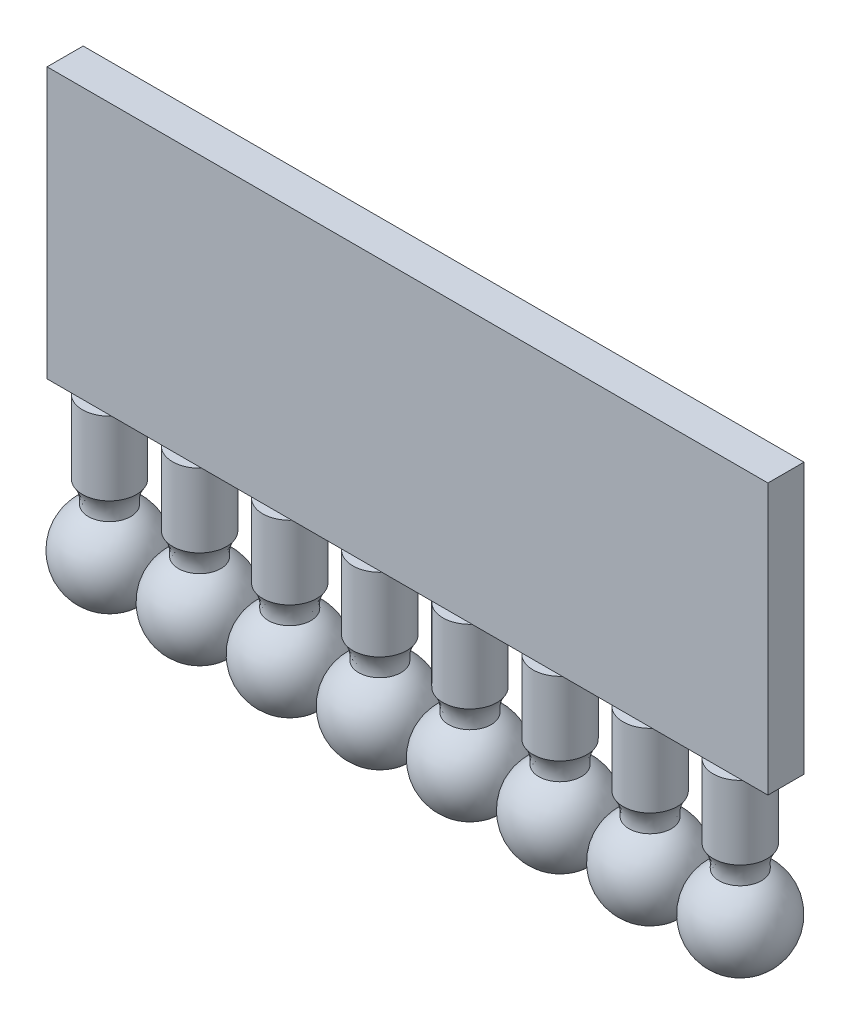
ISO-10303-21;
HEADER;
FILE_DESCRIPTION(('STEP AP214'),'2;1');
FILE_NAME('part.step','',(''),(''),'','','');
FILE_SCHEMA(('AUTOMOTIVE_DESIGN { 1 0 10303 214 1 1 1 1 }'));
ENDSEC;
DATA;
#1=APPLICATION_CONTEXT('core data for automotive mechanical design processes');
#2=APPLICATION_PROTOCOL_DEFINITION('international standard','automotive_design',2000,#1);
#3=PRODUCT_CONTEXT('',#1,'mechanical');
#4=PRODUCT('Part','Part','',(#3));
#5=PRODUCT_RELATED_PRODUCT_CATEGORY('part','',(#4));
#6=PRODUCT_DEFINITION_FORMATION('','',#4);
#7=PRODUCT_DEFINITION_CONTEXT('part definition',#1,'design');
#8=PRODUCT_DEFINITION('design','',#6,#7);
#9=PRODUCT_DEFINITION_SHAPE('','',#8);
#10=(LENGTH_UNIT() NAMED_UNIT(*) SI_UNIT(.MILLI.,.METRE.));
#11=(NAMED_UNIT(*) PLANE_ANGLE_UNIT() SI_UNIT($,.RADIAN.));
#12=(NAMED_UNIT(*) SI_UNIT($,.STERADIAN.) SOLID_ANGLE_UNIT());
#13=UNCERTAINTY_MEASURE_WITH_UNIT(LENGTH_MEASURE(1.E-05),#10,'distance_accuracy_value','');
#14=(GEOMETRIC_REPRESENTATION_CONTEXT(3) GLOBAL_UNCERTAINTY_ASSIGNED_CONTEXT((#13)) GLOBAL_UNIT_ASSIGNED_CONTEXT((#10,
#11,#12)) REPRESENTATION_CONTEXT('',''));
#15=CARTESIAN_POINT('',(0.,0.,0.));
#16=DIRECTION('',(0.,0.,1.));
#17=DIRECTION('',(1.,0.,0.));
#18=AXIS2_PLACEMENT_3D('',#15,#16,#17);
#19=CARTESIAN_POINT('',(37.4635416345214,0.,1.));
#20=DIRECTION('',(0.,-1.,0.));
#21=DIRECTION('',(1.,0.,0.));
#22=AXIS2_PLACEMENT_3D('',#19,#20,#21);
#23=PLANE('',#22);
#24=CARTESIAN_POINT('',(37.4635416345214,0.,1.));
#25=DIRECTION('',(0.,1.,0.));
#26=DIRECTION('',(-1.,0.,0.));
#27=AXIS2_PLACEMENT_3D('',#24,#25,#26);
#28=CIRCLE('',#27,1.5);
#29=CARTESIAN_POINT('',(35.9635416345214,0.,1.));
#30=VERTEX_POINT('',#29);
#31=EDGE_CURVE('E11',#30,#30,#28,.T.);
#32=ORIENTED_EDGE('',*,*,#31,.T.);
#33=EDGE_LOOP('',(#32));
#34=FACE_BOUND('',#33,.T.);
#35=ADVANCED_FACE('F45',(#34),#23,.F.);
#36=CARTESIAN_POINT('',(37.4635416345214,0.,1.));
#37=DIRECTION('',(0.,1.,0.));
#38=DIRECTION('',(-1.,0.,0.));
#39=AXIS2_PLACEMENT_3D('',#36,#37,#38);
#40=CYLINDRICAL_SURFACE('',#39,1.5);
#41=ORIENTED_EDGE('',*,*,#31,.F.);
#42=EDGE_LOOP('',(#41));
#43=FACE_BOUND('',#42,.T.);
#44=CARTESIAN_POINT('',(37.4635416345214,-4.07089085936718,1.));
#45=DIRECTION('',(0.,1.,0.));
#46=DIRECTION('',(-1.,0.,0.));
#47=AXIS2_PLACEMENT_3D('',#44,#45,#46);
#48=CIRCLE('',#47,1.5);
#49=CARTESIAN_POINT('',(35.9635416345214,-4.07089085936718,1.));
#50=VERTEX_POINT('',#49);
#51=EDGE_CURVE('E51',#50,#50,#48,.T.);
#52=ORIENTED_EDGE('',*,*,#51,.T.);
#53=EDGE_LOOP('',(#52));
#54=FACE_BOUND('',#53,.T.);
#55=ADVANCED_FACE('F72',(#43,#54),#40,.T.);
#56=CARTESIAN_POINT('',(38.6419699314246,-5.29516287470982,1.));
#57=CARTESIAN_POINT('',(38.571125169039,-4.639795433656,1.));
#58=CARTESIAN_POINT('',(38.9635416345214,-4.07089085936718,1.));
#59=B_SPLINE_CURVE_WITH_KNOTS('',2,(#56,#57,#58),.UNSPECIFIED.,.F.,.F.,(3,3),(0.,1.),.UNSPECIFIED.);
#60=CARTESIAN_POINT('',(37.4635416345214,0.,1.));
#61=DIRECTION('',(0.,1.,0.));
#62=AXIS1_PLACEMENT('',#60,#61);
#63=SURFACE_OF_REVOLUTION('',#59,#62);
#64=ORIENTED_EDGE('',*,*,#51,.F.);
#65=EDGE_LOOP('',(#64));
#66=FACE_BOUND('',#65,.T.);
#67=CARTESIAN_POINT('',(37.4635416345214,-5.29516287470982,1.));
#68=DIRECTION('',(0.,1.,0.));
#69=DIRECTION('',(-1.,0.,0.));
#70=AXIS2_PLACEMENT_3D('',#67,#68,#69);
#71=CIRCLE('',#70,1.17842829690319);
#72=CARTESIAN_POINT('',(36.2851133376182,-5.29516287470982,1.));
#73=VERTEX_POINT('',#72);
#74=EDGE_CURVE('E55',#73,#73,#71,.T.);
#75=ORIENTED_EDGE('',*,*,#74,.T.);
#76=EDGE_LOOP('',(#75));
#77=FACE_BOUND('',#76,.T.);
#78=ADVANCED_FACE('F68',(#66,#77),#63,.T.);
#79=CARTESIAN_POINT('',(37.4635416345214,-7.5,1.));
#80=DIRECTION('',(0.,1.,0.));
#81=DIRECTION('',(-1.,0.,0.));
#82=AXIS2_PLACEMENT_3D('',#79,#80,#81);
#83=SPHERICAL_SURFACE('',#82,2.5);
#84=ORIENTED_EDGE('',*,*,#74,.F.);
#85=EDGE_LOOP('',(#84));
#86=FACE_BOUND('',#85,.T.);
#87=ADVANCED_FACE('F71',(#86),#83,.T.);
#88=CLOSED_SHELL('',(#35,#55,#78,#87));
#89=MANIFOLD_SOLID_BREP('B2',#88);
#90=CARTESIAN_POINT('',(32.4635416345214,0.,1.));
#91=DIRECTION('',(0.,-1.,0.));
#92=DIRECTION('',(1.,0.,0.));
#93=AXIS2_PLACEMENT_3D('',#90,#91,#92);
#94=PLANE('',#93);
#95=CARTESIAN_POINT('',(32.4635416345214,0.,1.));
#96=DIRECTION('',(0.,1.,0.));
#97=DIRECTION('',(-1.,0.,0.));
#98=AXIS2_PLACEMENT_3D('',#95,#96,#97);
#99=CIRCLE('',#98,1.5);
#100=CARTESIAN_POINT('',(30.9635416345214,0.,1.));
#101=VERTEX_POINT('',#100);
#102=EDGE_CURVE('E44',#101,#101,#99,.T.);
#103=ORIENTED_EDGE('',*,*,#102,.T.);
#104=EDGE_LOOP('',(#103));
#105=FACE_BOUND('',#104,.T.);
#106=ADVANCED_FACE('F121',(#105),#94,.F.);
#107=CARTESIAN_POINT('',(32.4635416345214,0.,1.));
#108=DIRECTION('',(0.,1.,0.));
#109=DIRECTION('',(-1.,0.,0.));
#110=AXIS2_PLACEMENT_3D('',#107,#108,#109);
#111=CYLINDRICAL_SURFACE('',#110,1.5);
#112=ORIENTED_EDGE('',*,*,#102,.F.);
#113=EDGE_LOOP('',(#112));
#114=FACE_BOUND('',#113,.T.);
#115=CARTESIAN_POINT('',(32.4635416345214,-4.07089085936718,1.));
#116=DIRECTION('',(0.,1.,0.));
#117=DIRECTION('',(-1.,0.,0.));
#118=AXIS2_PLACEMENT_3D('',#115,#116,#117);
#119=CIRCLE('',#118,1.5);
#120=CARTESIAN_POINT('',(30.9635416345214,-4.07089085936718,1.));
#121=VERTEX_POINT('',#120);
#122=EDGE_CURVE('E127',#121,#121,#119,.T.);
#123=ORIENTED_EDGE('',*,*,#122,.T.);
#124=EDGE_LOOP('',(#123));
#125=FACE_BOUND('',#124,.T.);
#126=ADVANCED_FACE('F148',(#114,#125),#111,.T.);
#127=CARTESIAN_POINT('',(33.6419699314246,-5.29516287470982,1.));
#128=CARTESIAN_POINT('',(33.571125169039,-4.639795433656,1.));
#129=CARTESIAN_POINT('',(33.9635416345214,-4.07089085936718,1.));
#130=B_SPLINE_CURVE_WITH_KNOTS('',2,(#127,#128,#129),.UNSPECIFIED.,.F.,.F.,(3,3),(0.,1.),.UNSPECIFIED.);
#131=CARTESIAN_POINT('',(32.4635416345214,0.,1.));
#132=DIRECTION('',(0.,1.,0.));
#133=AXIS1_PLACEMENT('',#131,#132);
#134=SURFACE_OF_REVOLUTION('',#130,#133);
#135=ORIENTED_EDGE('',*,*,#122,.F.);
#136=EDGE_LOOP('',(#135));
#137=FACE_BOUND('',#136,.T.);
#138=CARTESIAN_POINT('',(32.4635416345214,-5.29516287470982,1.));
#139=DIRECTION('',(0.,1.,0.));
#140=DIRECTION('',(-1.,0.,0.));
#141=AXIS2_PLACEMENT_3D('',#138,#139,#140);
#142=CIRCLE('',#141,1.17842829690319);
#143=CARTESIAN_POINT('',(31.2851133376182,-5.29516287470982,1.));
#144=VERTEX_POINT('',#143);
#145=EDGE_CURVE('E131',#144,#144,#142,.T.);
#146=ORIENTED_EDGE('',*,*,#145,.T.);
#147=EDGE_LOOP('',(#146));
#148=FACE_BOUND('',#147,.T.);
#149=ADVANCED_FACE('F144',(#137,#148),#134,.T.);
#150=CARTESIAN_POINT('',(32.4635416345214,-7.5,1.));
#151=DIRECTION('',(0.,1.,0.));
#152=DIRECTION('',(-1.,0.,0.));
#153=AXIS2_PLACEMENT_3D('',#150,#151,#152);
#154=SPHERICAL_SURFACE('',#153,2.5);
#155=ORIENTED_EDGE('',*,*,#145,.F.);
#156=EDGE_LOOP('',(#155));
#157=FACE_BOUND('',#156,.T.);
#158=ADVANCED_FACE('F147',(#157),#154,.T.);
#159=CLOSED_SHELL('',(#106,#126,#149,#158));
#160=MANIFOLD_SOLID_BREP('B6',#159);
#161=CARTESIAN_POINT('',(27.4635416345214,0.,1.));
#162=DIRECTION('',(0.,-1.,0.));
#163=DIRECTION('',(1.,0.,0.));
#164=AXIS2_PLACEMENT_3D('',#161,#162,#163);
#165=PLANE('',#164);
#166=CARTESIAN_POINT('',(27.4635416345214,0.,1.));
#167=DIRECTION('',(0.,1.,0.));
#168=DIRECTION('',(-1.,0.,0.));
#169=AXIS2_PLACEMENT_3D('',#166,#167,#168);
#170=CIRCLE('',#169,1.5);
#171=CARTESIAN_POINT('',(25.9635416345214,0.,1.));
#172=VERTEX_POINT('',#171);
#173=EDGE_CURVE('E120',#172,#172,#170,.T.);
#174=ORIENTED_EDGE('',*,*,#173,.T.);
#175=EDGE_LOOP('',(#174));
#176=FACE_BOUND('',#175,.T.);
#177=ADVANCED_FACE('F191',(#176),#165,.F.);
#178=CARTESIAN_POINT('',(27.4635416345214,0.,1.));
#179=DIRECTION('',(0.,1.,0.));
#180=DIRECTION('',(-1.,0.,0.));
#181=AXIS2_PLACEMENT_3D('',#178,#179,#180);
#182=CYLINDRICAL_SURFACE('',#181,1.5);
#183=ORIENTED_EDGE('',*,*,#173,.F.);
#184=EDGE_LOOP('',(#183));
#185=FACE_BOUND('',#184,.T.);
#186=CARTESIAN_POINT('',(27.4635416345214,-4.07089085936718,1.));
#187=DIRECTION('',(0.,1.,0.));
#188=DIRECTION('',(-1.,0.,0.));
#189=AXIS2_PLACEMENT_3D('',#186,#187,#188);
#190=CIRCLE('',#189,1.5);
#191=CARTESIAN_POINT('',(25.9635416345214,-4.07089085936718,1.));
#192=VERTEX_POINT('',#191);
#193=EDGE_CURVE('E197',#192,#192,#190,.T.);
#194=ORIENTED_EDGE('',*,*,#193,.T.);
#195=EDGE_LOOP('',(#194));
#196=FACE_BOUND('',#195,.T.);
#197=ADVANCED_FACE('F218',(#185,#196),#182,.T.);
#198=CARTESIAN_POINT('',(28.6419699314246,-5.29516287470982,1.));
#199=CARTESIAN_POINT('',(28.571125169039,-4.639795433656,1.));
#200=CARTESIAN_POINT('',(28.9635416345214,-4.07089085936718,1.));
#201=B_SPLINE_CURVE_WITH_KNOTS('',2,(#198,#199,#200),.UNSPECIFIED.,.F.,.F.,(3,3),(0.,1.),.UNSPECIFIED.);
#202=CARTESIAN_POINT('',(27.4635416345214,0.,1.));
#203=DIRECTION('',(0.,1.,0.));
#204=AXIS1_PLACEMENT('',#202,#203);
#205=SURFACE_OF_REVOLUTION('',#201,#204);
#206=ORIENTED_EDGE('',*,*,#193,.F.);
#207=EDGE_LOOP('',(#206));
#208=FACE_BOUND('',#207,.T.);
#209=CARTESIAN_POINT('',(27.4635416345214,-5.29516287470982,1.));
#210=DIRECTION('',(0.,1.,0.));
#211=DIRECTION('',(-1.,0.,0.));
#212=AXIS2_PLACEMENT_3D('',#209,#210,#211);
#213=CIRCLE('',#212,1.17842829690319);
#214=CARTESIAN_POINT('',(26.2851133376182,-5.29516287470982,1.));
#215=VERTEX_POINT('',#214);
#216=EDGE_CURVE('E201',#215,#215,#213,.T.);
#217=ORIENTED_EDGE('',*,*,#216,.T.);
#218=EDGE_LOOP('',(#217));
#219=FACE_BOUND('',#218,.T.);
#220=ADVANCED_FACE('F214',(#208,#219),#205,.T.);
#221=CARTESIAN_POINT('',(27.4635416345214,-7.5,1.));
#222=DIRECTION('',(0.,1.,0.));
#223=DIRECTION('',(-1.,0.,0.));
#224=AXIS2_PLACEMENT_3D('',#221,#222,#223);
#225=SPHERICAL_SURFACE('',#224,2.5);
#226=ORIENTED_EDGE('',*,*,#216,.F.);
#227=EDGE_LOOP('',(#226));
#228=FACE_BOUND('',#227,.T.);
#229=ADVANCED_FACE('F217',(#228),#225,.T.);
#230=CLOSED_SHELL('',(#177,#197,#220,#229));
#231=MANIFOLD_SOLID_BREP('B39',#230);
#232=CARTESIAN_POINT('',(22.4635416345214,0.,1.));
#233=DIRECTION('',(0.,-1.,0.));
#234=DIRECTION('',(1.,0.,0.));
#235=AXIS2_PLACEMENT_3D('',#232,#233,#234);
#236=PLANE('',#235);
#237=CARTESIAN_POINT('',(22.4635416345214,0.,1.));
#238=DIRECTION('',(0.,1.,0.));
#239=DIRECTION('',(-1.,0.,0.));
#240=AXIS2_PLACEMENT_3D('',#237,#238,#239);
#241=CIRCLE('',#240,1.5);
#242=CARTESIAN_POINT('',(20.9635416345214,0.,1.));
#243=VERTEX_POINT('',#242);
#244=EDGE_CURVE('E190',#243,#243,#241,.T.);
#245=ORIENTED_EDGE('',*,*,#244,.T.);
#246=EDGE_LOOP('',(#245));
#247=FACE_BOUND('',#246,.T.);
#248=ADVANCED_FACE('F267',(#247),#236,.F.);
#249=CARTESIAN_POINT('',(22.4635416345214,0.,1.));
#250=DIRECTION('',(0.,1.,0.));
#251=DIRECTION('',(-1.,0.,0.));
#252=AXIS2_PLACEMENT_3D('',#249,#250,#251);
#253=CYLINDRICAL_SURFACE('',#252,1.5);
#254=ORIENTED_EDGE('',*,*,#244,.F.);
#255=EDGE_LOOP('',(#254));
#256=FACE_BOUND('',#255,.T.);
#257=CARTESIAN_POINT('',(22.4635416345214,-4.07089085936718,1.));
#258=DIRECTION('',(0.,1.,0.));
#259=DIRECTION('',(-1.,0.,0.));
#260=AXIS2_PLACEMENT_3D('',#257,#258,#259);
#261=CIRCLE('',#260,1.5);
#262=CARTESIAN_POINT('',(20.9635416345214,-4.07089085936718,1.));
#263=VERTEX_POINT('',#262);
#264=EDGE_CURVE('E273',#263,#263,#261,.T.);
#265=ORIENTED_EDGE('',*,*,#264,.T.);
#266=EDGE_LOOP('',(#265));
#267=FACE_BOUND('',#266,.T.);
#268=ADVANCED_FACE('F294',(#256,#267),#253,.T.);
#269=CARTESIAN_POINT('',(23.6419699314246,-5.29516287470982,1.));
#270=CARTESIAN_POINT('',(23.571125169039,-4.639795433656,1.));
#271=CARTESIAN_POINT('',(23.9635416345214,-4.07089085936718,1.));
#272=B_SPLINE_CURVE_WITH_KNOTS('',2,(#269,#270,#271),.UNSPECIFIED.,.F.,.F.,(3,3),(0.,1.),.UNSPECIFIED.);
#273=CARTESIAN_POINT('',(22.4635416345214,0.,1.));
#274=DIRECTION('',(0.,1.,0.));
#275=AXIS1_PLACEMENT('',#273,#274);
#276=SURFACE_OF_REVOLUTION('',#272,#275);
#277=ORIENTED_EDGE('',*,*,#264,.F.);
#278=EDGE_LOOP('',(#277));
#279=FACE_BOUND('',#278,.T.);
#280=CARTESIAN_POINT('',(22.4635416345214,-5.29516287470982,1.));
#281=DIRECTION('',(0.,1.,0.));
#282=DIRECTION('',(-1.,0.,0.));
#283=AXIS2_PLACEMENT_3D('',#280,#281,#282);
#284=CIRCLE('',#283,1.17842829690319);
#285=CARTESIAN_POINT('',(21.2851133376182,-5.29516287470982,1.));
#286=VERTEX_POINT('',#285);
#287=EDGE_CURVE('E277',#286,#286,#284,.T.);
#288=ORIENTED_EDGE('',*,*,#287,.T.);
#289=EDGE_LOOP('',(#288));
#290=FACE_BOUND('',#289,.T.);
#291=ADVANCED_FACE('F290',(#279,#290),#276,.T.);
#292=CARTESIAN_POINT('',(22.4635416345214,-7.5,1.));
#293=DIRECTION('',(0.,1.,0.));
#294=DIRECTION('',(-1.,0.,0.));
#295=AXIS2_PLACEMENT_3D('',#292,#293,#294);
#296=SPHERICAL_SURFACE('',#295,2.5);
#297=ORIENTED_EDGE('',*,*,#287,.F.);
#298=EDGE_LOOP('',(#297));
#299=FACE_BOUND('',#298,.T.);
#300=ADVANCED_FACE('F293',(#299),#296,.T.);
#301=CLOSED_SHELL('',(#248,#268,#291,#300));
#302=MANIFOLD_SOLID_BREP('B115',#301);
#303=CARTESIAN_POINT('',(17.4635416345214,0.,1.));
#304=DIRECTION('',(0.,-1.,0.));
#305=DIRECTION('',(1.,0.,0.));
#306=AXIS2_PLACEMENT_3D('',#303,#304,#305);
#307=PLANE('',#306);
#308=CARTESIAN_POINT('',(17.4635416345214,0.,1.));
#309=DIRECTION('',(0.,1.,0.));
#310=DIRECTION('',(-1.,0.,0.));
#311=AXIS2_PLACEMENT_3D('',#308,#309,#310);
#312=CIRCLE('',#311,1.5);
#313=CARTESIAN_POINT('',(15.9635416345214,0.,1.));
#314=VERTEX_POINT('',#313);
#315=EDGE_CURVE('E266',#314,#314,#312,.T.);
#316=ORIENTED_EDGE('',*,*,#315,.T.);
#317=EDGE_LOOP('',(#316));
#318=FACE_BOUND('',#317,.T.);
#319=ADVANCED_FACE('F337',(#318),#307,.F.);
#320=CARTESIAN_POINT('',(17.4635416345214,0.,1.));
#321=DIRECTION('',(0.,1.,0.));
#322=DIRECTION('',(-1.,0.,0.));
#323=AXIS2_PLACEMENT_3D('',#320,#321,#322);
#324=CYLINDRICAL_SURFACE('',#323,1.5);
#325=ORIENTED_EDGE('',*,*,#315,.F.);
#326=EDGE_LOOP('',(#325));
#327=FACE_BOUND('',#326,.T.);
#328=CARTESIAN_POINT('',(17.4635416345214,-4.07089085936718,1.));
#329=DIRECTION('',(0.,1.,0.));
#330=DIRECTION('',(-1.,0.,0.));
#331=AXIS2_PLACEMENT_3D('',#328,#329,#330);
#332=CIRCLE('',#331,1.5);
#333=CARTESIAN_POINT('',(15.9635416345214,-4.07089085936718,1.));
#334=VERTEX_POINT('',#333);
#335=EDGE_CURVE('E343',#334,#334,#332,.T.);
#336=ORIENTED_EDGE('',*,*,#335,.T.);
#337=EDGE_LOOP('',(#336));
#338=FACE_BOUND('',#337,.T.);
#339=ADVANCED_FACE('F364',(#327,#338),#324,.T.);
#340=CARTESIAN_POINT('',(18.6419699314246,-5.29516287470982,1.));
#341=CARTESIAN_POINT('',(18.571125169039,-4.639795433656,1.));
#342=CARTESIAN_POINT('',(18.9635416345214,-4.07089085936718,1.));
#343=B_SPLINE_CURVE_WITH_KNOTS('',2,(#340,#341,#342),.UNSPECIFIED.,.F.,.F.,(3,3),(0.,1.),.UNSPECIFIED.);
#344=CARTESIAN_POINT('',(17.4635416345214,0.,1.));
#345=DIRECTION('',(0.,1.,0.));
#346=AXIS1_PLACEMENT('',#344,#345);
#347=SURFACE_OF_REVOLUTION('',#343,#346);
#348=ORIENTED_EDGE('',*,*,#335,.F.);
#349=EDGE_LOOP('',(#348));
#350=FACE_BOUND('',#349,.T.);
#351=CARTESIAN_POINT('',(17.4635416345214,-5.29516287470982,1.));
#352=DIRECTION('',(0.,1.,0.));
#353=DIRECTION('',(-1.,0.,0.));
#354=AXIS2_PLACEMENT_3D('',#351,#352,#353);
#355=CIRCLE('',#354,1.17842829690319);
#356=CARTESIAN_POINT('',(16.2851133376182,-5.29516287470982,1.));
#357=VERTEX_POINT('',#356);
#358=EDGE_CURVE('E347',#357,#357,#355,.T.);
#359=ORIENTED_EDGE('',*,*,#358,.T.);
#360=EDGE_LOOP('',(#359));
#361=FACE_BOUND('',#360,.T.);
#362=ADVANCED_FACE('F360',(#350,#361),#347,.T.);
#363=CARTESIAN_POINT('',(17.4635416345214,-7.5,1.));
#364=DIRECTION('',(0.,1.,0.));
#365=DIRECTION('',(-1.,0.,0.));
#366=AXIS2_PLACEMENT_3D('',#363,#364,#365);
#367=SPHERICAL_SURFACE('',#366,2.5);
#368=ORIENTED_EDGE('',*,*,#358,.F.);
#369=EDGE_LOOP('',(#368));
#370=FACE_BOUND('',#369,.T.);
#371=ADVANCED_FACE('F363',(#370),#367,.T.);
#372=CLOSED_SHELL('',(#319,#339,#362,#371));
#373=MANIFOLD_SOLID_BREP('B185',#372);
#374=CARTESIAN_POINT('',(12.4635416345214,0.,1.));
#375=DIRECTION('',(0.,-1.,0.));
#376=DIRECTION('',(1.,0.,0.));
#377=AXIS2_PLACEMENT_3D('',#374,#375,#376);
#378=PLANE('',#377);
#379=CARTESIAN_POINT('',(12.4635416345214,0.,1.));
#380=DIRECTION('',(0.,1.,0.));
#381=DIRECTION('',(-1.,0.,0.));
#382=AXIS2_PLACEMENT_3D('',#379,#380,#381);
#383=CIRCLE('',#382,1.5);
#384=CARTESIAN_POINT('',(10.9635416345214,0.,1.));
#385=VERTEX_POINT('',#384);
#386=EDGE_CURVE('E336',#385,#385,#383,.T.);
#387=ORIENTED_EDGE('',*,*,#386,.T.);
#388=EDGE_LOOP('',(#387));
#389=FACE_BOUND('',#388,.T.);
#390=ADVANCED_FACE('F413',(#389),#378,.F.);
#391=CARTESIAN_POINT('',(12.4635416345214,0.,1.));
#392=DIRECTION('',(0.,1.,0.));
#393=DIRECTION('',(-1.,0.,0.));
#394=AXIS2_PLACEMENT_3D('',#391,#392,#393);
#395=CYLINDRICAL_SURFACE('',#394,1.5);
#396=ORIENTED_EDGE('',*,*,#386,.F.);
#397=EDGE_LOOP('',(#396));
#398=FACE_BOUND('',#397,.T.);
#399=CARTESIAN_POINT('',(12.4635416345214,-4.07089085936718,1.));
#400=DIRECTION('',(0.,1.,0.));
#401=DIRECTION('',(-1.,0.,0.));
#402=AXIS2_PLACEMENT_3D('',#399,#400,#401);
#403=CIRCLE('',#402,1.5);
#404=CARTESIAN_POINT('',(10.9635416345214,-4.07089085936718,1.));
#405=VERTEX_POINT('',#404);
#406=EDGE_CURVE('E419',#405,#405,#403,.T.);
#407=ORIENTED_EDGE('',*,*,#406,.T.);
#408=EDGE_LOOP('',(#407));
#409=FACE_BOUND('',#408,.T.);
#410=ADVANCED_FACE('F440',(#398,#409),#395,.T.);
#411=CARTESIAN_POINT('',(13.6419699314246,-5.29516287470982,1.));
#412=CARTESIAN_POINT('',(13.571125169039,-4.639795433656,1.));
#413=CARTESIAN_POINT('',(13.9635416345214,-4.07089085936718,1.));
#414=B_SPLINE_CURVE_WITH_KNOTS('',2,(#411,#412,#413),.UNSPECIFIED.,.F.,.F.,(3,3),(0.,1.),.UNSPECIFIED.);
#415=CARTESIAN_POINT('',(12.4635416345214,0.,1.));
#416=DIRECTION('',(0.,1.,0.));
#417=AXIS1_PLACEMENT('',#415,#416);
#418=SURFACE_OF_REVOLUTION('',#414,#417);
#419=ORIENTED_EDGE('',*,*,#406,.F.);
#420=EDGE_LOOP('',(#419));
#421=FACE_BOUND('',#420,.T.);
#422=CARTESIAN_POINT('',(12.4635416345214,-5.29516287470982,1.));
#423=DIRECTION('',(0.,1.,0.));
#424=DIRECTION('',(-1.,0.,0.));
#425=AXIS2_PLACEMENT_3D('',#422,#423,#424);
#426=CIRCLE('',#425,1.17842829690319);
#427=CARTESIAN_POINT('',(11.2851133376182,-5.29516287470982,1.));
#428=VERTEX_POINT('',#427);
#429=EDGE_CURVE('E423',#428,#428,#426,.T.);
#430=ORIENTED_EDGE('',*,*,#429,.T.);
#431=EDGE_LOOP('',(#430));
#432=FACE_BOUND('',#431,.T.);
#433=ADVANCED_FACE('F436',(#421,#432),#418,.T.);
#434=CARTESIAN_POINT('',(12.4635416345214,-7.5,1.));
#435=DIRECTION('',(0.,1.,0.));
#436=DIRECTION('',(-1.,0.,0.));
#437=AXIS2_PLACEMENT_3D('',#434,#435,#436);
#438=SPHERICAL_SURFACE('',#437,2.5);
#439=ORIENTED_EDGE('',*,*,#429,.F.);
#440=EDGE_LOOP('',(#439));
#441=FACE_BOUND('',#440,.T.);
#442=ADVANCED_FACE('F439',(#441),#438,.T.);
#443=CLOSED_SHELL('',(#390,#410,#433,#442));
#444=MANIFOLD_SOLID_BREP('B261',#443);
#445=CARTESIAN_POINT('',(7.46354163452136,0.,1.));
#446=DIRECTION('',(0.,-1.,0.));
#447=DIRECTION('',(1.,0.,0.));
#448=AXIS2_PLACEMENT_3D('',#445,#446,#447);
#449=PLANE('',#448);
#450=CARTESIAN_POINT('',(7.46354163452136,0.,1.));
#451=DIRECTION('',(0.,1.,0.));
#452=DIRECTION('',(-1.,0.,0.));
#453=AXIS2_PLACEMENT_3D('',#450,#451,#452);
#454=CIRCLE('',#453,1.5);
#455=CARTESIAN_POINT('',(5.96354163452136,0.,1.));
#456=VERTEX_POINT('',#455);
#457=EDGE_CURVE('E412',#456,#456,#454,.T.);
#458=ORIENTED_EDGE('',*,*,#457,.T.);
#459=EDGE_LOOP('',(#458));
#460=FACE_BOUND('',#459,.T.);
#461=ADVANCED_FACE('F483',(#460),#449,.F.);
#462=CARTESIAN_POINT('',(7.46354163452136,0.,1.));
#463=DIRECTION('',(0.,1.,0.));
#464=DIRECTION('',(-1.,0.,0.));
#465=AXIS2_PLACEMENT_3D('',#462,#463,#464);
#466=CYLINDRICAL_SURFACE('',#465,1.5);
#467=ORIENTED_EDGE('',*,*,#457,.F.);
#468=EDGE_LOOP('',(#467));
#469=FACE_BOUND('',#468,.T.);
#470=CARTESIAN_POINT('',(7.46354163452136,-4.07089085936718,1.));
#471=DIRECTION('',(0.,1.,0.));
#472=DIRECTION('',(-1.,0.,0.));
#473=AXIS2_PLACEMENT_3D('',#470,#471,#472);
#474=CIRCLE('',#473,1.5);
#475=CARTESIAN_POINT('',(5.96354163452136,-4.07089085936718,1.));
#476=VERTEX_POINT('',#475);
#477=EDGE_CURVE('E489',#476,#476,#474,.T.);
#478=ORIENTED_EDGE('',*,*,#477,.T.);
#479=EDGE_LOOP('',(#478));
#480=FACE_BOUND('',#479,.T.);
#481=ADVANCED_FACE('F510',(#469,#480),#466,.T.);
#482=CARTESIAN_POINT('',(8.64196993142455,-5.29516287470982,1.));
#483=CARTESIAN_POINT('',(8.57112516903897,-4.639795433656,1.));
#484=CARTESIAN_POINT('',(8.96354163452136,-4.07089085936718,1.));
#485=B_SPLINE_CURVE_WITH_KNOTS('',2,(#482,#483,#484),.UNSPECIFIED.,.F.,.F.,(3,3),(0.,1.),.UNSPECIFIED.);
#486=CARTESIAN_POINT('',(7.46354163452136,0.,1.));
#487=DIRECTION('',(0.,1.,0.));
#488=AXIS1_PLACEMENT('',#486,#487);
#489=SURFACE_OF_REVOLUTION('',#485,#488);
#490=ORIENTED_EDGE('',*,*,#477,.F.);
#491=EDGE_LOOP('',(#490));
#492=FACE_BOUND('',#491,.T.);
#493=CARTESIAN_POINT('',(7.46354163452136,-5.29516287470982,1.));
#494=DIRECTION('',(0.,1.,0.));
#495=DIRECTION('',(-1.,0.,0.));
#496=AXIS2_PLACEMENT_3D('',#493,#494,#495);
#497=CIRCLE('',#496,1.17842829690319);
#498=CARTESIAN_POINT('',(6.28511333761817,-5.29516287470982,1.));
#499=VERTEX_POINT('',#498);
#500=EDGE_CURVE('E493',#499,#499,#497,.T.);
#501=ORIENTED_EDGE('',*,*,#500,.T.);
#502=EDGE_LOOP('',(#501));
#503=FACE_BOUND('',#502,.T.);
#504=ADVANCED_FACE('F506',(#492,#503),#489,.T.);
#505=CARTESIAN_POINT('',(7.46354163452136,-7.5,1.));
#506=DIRECTION('',(0.,1.,0.));
#507=DIRECTION('',(-1.,0.,0.));
#508=AXIS2_PLACEMENT_3D('',#505,#506,#507);
#509=SPHERICAL_SURFACE('',#508,2.5);
#510=ORIENTED_EDGE('',*,*,#500,.F.);
#511=EDGE_LOOP('',(#510));
#512=FACE_BOUND('',#511,.T.);
#513=ADVANCED_FACE('F509',(#512),#509,.T.);
#514=CLOSED_SHELL('',(#461,#481,#504,#513));
#515=MANIFOLD_SOLID_BREP('B331',#514);
#516=CARTESIAN_POINT('',(2.46354163452136,0.,1.));
#517=DIRECTION('',(0.,-1.,0.));
#518=DIRECTION('',(1.,0.,0.));
#519=AXIS2_PLACEMENT_3D('',#516,#517,#518);
#520=PLANE('',#519);
#521=CARTESIAN_POINT('',(2.46354163452136,0.,1.));
#522=DIRECTION('',(0.,1.,0.));
#523=DIRECTION('',(-1.,0.,0.));
#524=AXIS2_PLACEMENT_3D('',#521,#522,#523);
#525=CIRCLE('',#524,1.5);
#526=CARTESIAN_POINT('',(0.963541634521362,0.,1.));
#527=VERTEX_POINT('',#526);
#528=EDGE_CURVE('E482',#527,#527,#525,.T.);
#529=ORIENTED_EDGE('',*,*,#528,.T.);
#530=EDGE_LOOP('',(#529));
#531=FACE_BOUND('',#530,.T.);
#532=ADVANCED_FACE('F554',(#531),#520,.F.);
#533=CARTESIAN_POINT('',(2.46354163452136,0.,1.));
#534=DIRECTION('',(0.,1.,0.));
#535=DIRECTION('',(-1.,0.,0.));
#536=AXIS2_PLACEMENT_3D('',#533,#534,#535);
#537=CYLINDRICAL_SURFACE('',#536,1.5);
#538=ORIENTED_EDGE('',*,*,#528,.F.);
#539=EDGE_LOOP('',(#538));
#540=FACE_BOUND('',#539,.T.);
#541=CARTESIAN_POINT('',(2.46354163452136,-4.07089085936718,1.));
#542=DIRECTION('',(0.,1.,0.));
#543=DIRECTION('',(-1.,0.,0.));
#544=AXIS2_PLACEMENT_3D('',#541,#542,#543);
#545=CIRCLE('',#544,1.5);
#546=CARTESIAN_POINT('',(0.963541634521362,-4.07089085936718,1.));
#547=VERTEX_POINT('',#546);
#548=EDGE_CURVE('E560',#547,#547,#545,.T.);
#549=ORIENTED_EDGE('',*,*,#548,.T.);
#550=EDGE_LOOP('',(#549));
#551=FACE_BOUND('',#550,.T.);
#552=ADVANCED_FACE('F581',(#540,#551),#537,.T.);
#553=CARTESIAN_POINT('',(3.64196993142455,-5.29516287470982,1.));
#554=CARTESIAN_POINT('',(3.57112516903897,-4.639795433656,1.));
#555=CARTESIAN_POINT('',(3.96354163452136,-4.07089085936718,1.));
#556=B_SPLINE_CURVE_WITH_KNOTS('',2,(#553,#554,#555),.UNSPECIFIED.,.F.,.F.,(3,3),(0.,1.),.UNSPECIFIED.);
#557=CARTESIAN_POINT('',(2.46354163452136,0.,1.));
#558=DIRECTION('',(0.,1.,0.));
#559=AXIS1_PLACEMENT('',#557,#558);
#560=SURFACE_OF_REVOLUTION('',#556,#559);
#561=ORIENTED_EDGE('',*,*,#548,.F.);
#562=EDGE_LOOP('',(#561));
#563=FACE_BOUND('',#562,.T.);
#564=CARTESIAN_POINT('',(2.46354163452136,-5.29516287470982,1.));
#565=DIRECTION('',(0.,1.,0.));
#566=DIRECTION('',(-1.,0.,0.));
#567=AXIS2_PLACEMENT_3D('',#564,#565,#566);
#568=CIRCLE('',#567,1.17842829690319);
#569=CARTESIAN_POINT('',(1.28511333761817,-5.29516287470982,1.));
#570=VERTEX_POINT('',#569);
#571=EDGE_CURVE('E564',#570,#570,#568,.T.);
#572=ORIENTED_EDGE('',*,*,#571,.T.);
#573=EDGE_LOOP('',(#572));
#574=FACE_BOUND('',#573,.T.);
#575=ADVANCED_FACE('F577',(#563,#574),#560,.T.);
#576=CARTESIAN_POINT('',(2.46354163452136,-7.5,1.));
#577=DIRECTION('',(0.,1.,0.));
#578=DIRECTION('',(-1.,0.,0.));
#579=AXIS2_PLACEMENT_3D('',#576,#577,#578);
#580=SPHERICAL_SURFACE('',#579,2.5);
#581=ORIENTED_EDGE('',*,*,#571,.F.);
#582=EDGE_LOOP('',(#581));
#583=FACE_BOUND('',#582,.T.);
#584=ADVANCED_FACE('F580',(#583),#580,.T.);
#585=CLOSED_SHELL('',(#532,#552,#575,#584));
#586=MANIFOLD_SOLID_BREP('B407',#585);
#587=CARTESIAN_POINT('',(0.,0.,2.));
#588=DIRECTION('',(1.,0.,0.));
#589=DIRECTION('',(0.,1.,0.));
#590=AXIS2_PLACEMENT_3D('',#587,#588,#589);
#591=PLANE('',#590);
#592=DIRECTION('',(0.,-1.,0.));
#593=VECTOR('',#592,1.);
#594=CARTESIAN_POINT('',(0.,0.,0.));
#595=LINE('',#594,#593);
#596=CARTESIAN_POINT('',(0.,15.,0.));
#597=VERTEX_POINT('',#596);
#598=CARTESIAN_POINT('',(0.,0.,0.));
#599=VERTEX_POINT('',#598);
#600=EDGE_CURVE('E679',#597,#599,#595,.T.);
#601=ORIENTED_EDGE('',*,*,#600,.T.);
#602=DIRECTION('',(0.,0.,-1.));
#603=VECTOR('',#602,1.);
#604=CARTESIAN_POINT('',(0.,0.,2.));
#605=LINE('',#604,#603);
#606=CARTESIAN_POINT('',(0.,0.,2.));
#607=VERTEX_POINT('',#606);
#608=EDGE_CURVE('E552',#607,#599,#605,.T.);
#609=ORIENTED_EDGE('',*,*,#608,.F.);
#610=DIRECTION('',(0.,-1.,0.));
#611=VECTOR('',#610,1.);
#612=CARTESIAN_POINT('',(0.,0.,2.));
#613=LINE('',#612,#611);
#614=CARTESIAN_POINT('',(0.,15.,2.));
#615=VERTEX_POINT('',#614);
#616=EDGE_CURVE('E667',#615,#607,#613,.T.);
#617=ORIENTED_EDGE('',*,*,#616,.F.);
#618=DIRECTION('',(0.,0.,-1.));
#619=VECTOR('',#618,1.);
#620=CARTESIAN_POINT('',(0.,15.,2.));
#621=LINE('',#620,#619);
#622=EDGE_CURVE('E675',#615,#597,#621,.T.);
#623=ORIENTED_EDGE('',*,*,#622,.T.);
#624=EDGE_LOOP('',(#601,#609,#617,#623));
#625=FACE_BOUND('',#624,.T.);
#626=ADVANCED_FACE('F616',(#625),#591,.F.);
#627=CARTESIAN_POINT('',(0.,0.,2.));
#628=DIRECTION('',(0.,1.,0.));
#629=DIRECTION('',(0.,0.,1.));
#630=AXIS2_PLACEMENT_3D('',#627,#628,#629);
#631=PLANE('',#630);
#632=DIRECTION('',(1.,0.,0.));
#633=VECTOR('',#632,1.);
#634=CARTESIAN_POINT('',(0.,0.,0.));
#635=LINE('',#634,#633);
#636=CARTESIAN_POINT('',(40.,0.,0.));
#637=VERTEX_POINT('',#636);
#638=EDGE_CURVE('E671',#599,#637,#635,.T.);
#639=ORIENTED_EDGE('',*,*,#638,.T.);
#640=DIRECTION('',(0.,0.,-1.));
#641=VECTOR('',#640,1.);
#642=CARTESIAN_POINT('',(40.,0.,2.));
#643=LINE('',#642,#641);
#644=CARTESIAN_POINT('',(40.,0.,2.));
#645=VERTEX_POINT('',#644);
#646=EDGE_CURVE('E624',#645,#637,#643,.T.);
#647=ORIENTED_EDGE('',*,*,#646,.F.);
#648=DIRECTION('',(1.,0.,0.));
#649=VECTOR('',#648,1.);
#650=CARTESIAN_POINT('',(0.,0.,2.));
#651=LINE('',#650,#649);
#652=EDGE_CURVE('E662',#607,#645,#651,.T.);
#653=ORIENTED_EDGE('',*,*,#652,.F.);
#654=ORIENTED_EDGE('',*,*,#608,.T.);
#655=EDGE_LOOP('',(#639,#647,#653,#654));
#656=FACE_BOUND('',#655,.T.);
#657=ADVANCED_FACE('F670',(#656),#631,.F.);
#658=CARTESIAN_POINT('',(40.,0.,2.));
#659=DIRECTION('',(-1.,0.,0.));
#660=DIRECTION('',(0.,-1.,0.));
#661=AXIS2_PLACEMENT_3D('',#658,#659,#660);
#662=PLANE('',#661);
#663=DIRECTION('',(0.,1.,0.));
#664=VECTOR('',#663,1.);
#665=CARTESIAN_POINT('',(40.,0.,0.));
#666=LINE('',#665,#664);
#667=CARTESIAN_POINT('',(40.,15.,0.));
#668=VERTEX_POINT('',#667);
#669=EDGE_CURVE('E649',#637,#668,#666,.T.);
#670=ORIENTED_EDGE('',*,*,#669,.T.);
#671=DIRECTION('',(0.,0.,-1.));
#672=VECTOR('',#671,1.);
#673=CARTESIAN_POINT('',(40.,15.,2.));
#674=LINE('',#673,#672);
#675=CARTESIAN_POINT('',(40.,15.,2.));
#676=VERTEX_POINT('',#675);
#677=EDGE_CURVE('E672',#676,#668,#674,.T.);
#678=ORIENTED_EDGE('',*,*,#677,.F.);
#679=DIRECTION('',(0.,1.,0.));
#680=VECTOR('',#679,1.);
#681=CARTESIAN_POINT('',(40.,0.,2.));
#682=LINE('',#681,#680);
#683=EDGE_CURVE('E665',#645,#676,#682,.T.);
#684=ORIENTED_EDGE('',*,*,#683,.F.);
#685=ORIENTED_EDGE('',*,*,#646,.T.);
#686=EDGE_LOOP('',(#670,#678,#684,#685));
#687=FACE_BOUND('',#686,.T.);
#688=ADVANCED_FACE('F673',(#687),#662,.F.);
#689=CARTESIAN_POINT('',(0.,15.,2.));
#690=DIRECTION('',(0.,-1.,0.));
#691=DIRECTION('',(0.,0.,-1.));
#692=AXIS2_PLACEMENT_3D('',#689,#690,#691);
#693=PLANE('',#692);
#694=DIRECTION('',(-1.,0.,0.));
#695=VECTOR('',#694,1.);
#696=CARTESIAN_POINT('',(0.,15.,0.));
#697=LINE('',#696,#695);
#698=EDGE_CURVE('E655',#668,#597,#697,.T.);
#699=ORIENTED_EDGE('',*,*,#698,.T.);
#700=ORIENTED_EDGE('',*,*,#622,.F.);
#701=DIRECTION('',(-1.,0.,0.));
#702=VECTOR('',#701,1.);
#703=CARTESIAN_POINT('',(0.,15.,2.));
#704=LINE('',#703,#702);
#705=EDGE_CURVE('E632',#676,#615,#704,.T.);
#706=ORIENTED_EDGE('',*,*,#705,.F.);
#707=ORIENTED_EDGE('',*,*,#677,.T.);
#708=EDGE_LOOP('',(#699,#700,#706,#707));
#709=FACE_BOUND('',#708,.T.);
#710=ADVANCED_FACE('F686',(#709),#693,.F.);
#711=CARTESIAN_POINT('',(0.,0.,2.));
#712=DIRECTION('',(0.,0.,-1.));
#713=DIRECTION('',(-1.,0.,0.));
#714=AXIS2_PLACEMENT_3D('',#711,#712,#713);
#715=PLANE('',#714);
#716=ORIENTED_EDGE('',*,*,#616,.T.);
#717=ORIENTED_EDGE('',*,*,#652,.T.);
#718=ORIENTED_EDGE('',*,*,#683,.T.);
#719=ORIENTED_EDGE('',*,*,#705,.T.);
#720=EDGE_LOOP('',(#716,#717,#718,#719));
#721=FACE_BOUND('',#720,.T.);
#722=ADVANCED_FACE('F663',(#721),#715,.F.);
#723=CARTESIAN_POINT('',(0.,0.,0.));
#724=DIRECTION('',(0.,0.,-1.));
#725=DIRECTION('',(-1.,0.,0.));
#726=AXIS2_PLACEMENT_3D('',#723,#724,#725);
#727=PLANE('',#726);
#728=ORIENTED_EDGE('',*,*,#600,.F.);
#729=ORIENTED_EDGE('',*,*,#698,.F.);
#730=ORIENTED_EDGE('',*,*,#669,.F.);
#731=ORIENTED_EDGE('',*,*,#638,.F.);
#732=EDGE_LOOP('',(#728,#729,#730,#731));
#733=FACE_BOUND('',#732,.T.);
#734=ADVANCED_FACE('F689',(#733),#727,.T.);
#735=CLOSED_SHELL('',(#626,#657,#688,#710,#722,#734));
#736=MANIFOLD_SOLID_BREP('B477',#735);
#737=ADVANCED_BREP_SHAPE_REPRESENTATION('',(#18,#89,#160,#231,#302,#373,#444,#515,#586,#736),#14);
#738=SHAPE_DEFINITION_REPRESENTATION(#9,#737);
ENDSEC;
END-ISO-10303-21;
